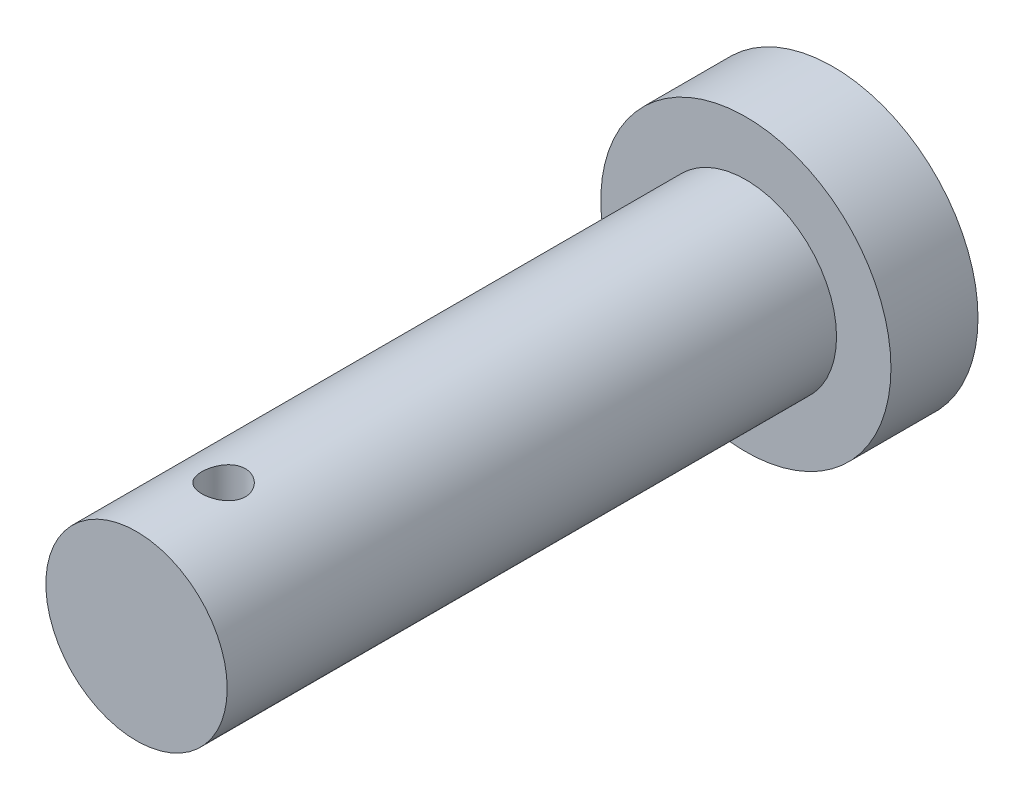
ISO-10303-21;
HEADER;
FILE_DESCRIPTION(('STEP AP214'),'2;1');
FILE_NAME('part.step','',(''),(''),'','','');
FILE_SCHEMA(('AUTOMOTIVE_DESIGN { 1 0 10303 214 1 1 1 1 }'));
ENDSEC;
DATA;
#1=APPLICATION_CONTEXT('core data for automotive mechanical design processes');
#2=APPLICATION_PROTOCOL_DEFINITION('international standard','automotive_design',2000,#1);
#3=PRODUCT_CONTEXT('',#1,'mechanical');
#4=PRODUCT('Part','Part','',(#3));
#5=PRODUCT_RELATED_PRODUCT_CATEGORY('part','',(#4));
#6=PRODUCT_DEFINITION_FORMATION('','',#4);
#7=PRODUCT_DEFINITION_CONTEXT('part definition',#1,'design');
#8=PRODUCT_DEFINITION('design','',#6,#7);
#9=PRODUCT_DEFINITION_SHAPE('','',#8);
#10=(LENGTH_UNIT() NAMED_UNIT(*) SI_UNIT(.MILLI.,.METRE.));
#11=(NAMED_UNIT(*) PLANE_ANGLE_UNIT() SI_UNIT($,.RADIAN.));
#12=(NAMED_UNIT(*) SI_UNIT($,.STERADIAN.) SOLID_ANGLE_UNIT());
#13=UNCERTAINTY_MEASURE_WITH_UNIT(LENGTH_MEASURE(1.E-05),#10,'distance_accuracy_value','');
#14=(GEOMETRIC_REPRESENTATION_CONTEXT(3) GLOBAL_UNCERTAINTY_ASSIGNED_CONTEXT((#13)) GLOBAL_UNIT_ASSIGNED_CONTEXT((#10,
#11,#12)) REPRESENTATION_CONTEXT('',''));
#15=CARTESIAN_POINT('',(0.,0.,0.));
#16=DIRECTION('',(0.,0.,1.));
#17=DIRECTION('',(1.,0.,0.));
#18=AXIS2_PLACEMENT_3D('',#15,#16,#17);
#19=CARTESIAN_POINT('',(0.,0.,12.));
#20=DIRECTION('',(0.,0.,-1.));
#21=DIRECTION('',(-1.,0.,0.));
#22=AXIS2_PLACEMENT_3D('',#19,#20,#21);
#23=CYLINDRICAL_SURFACE('',#22,20.);
#24=CARTESIAN_POINT('',(0.,0.,12.));
#25=DIRECTION('',(0.,0.,1.));
#26=DIRECTION('',(1.,0.,0.));
#27=AXIS2_PLACEMENT_3D('',#24,#25,#26);
#28=CIRCLE('',#27,20.);
#29=CARTESIAN_POINT('',(20.,0.,12.));
#30=VERTEX_POINT('',#29);
#31=EDGE_CURVE('E43',#30,#30,#28,.T.);
#32=ORIENTED_EDGE('',*,*,#31,.F.);
#33=EDGE_LOOP('',(#32));
#34=FACE_BOUND('',#33,.T.);
#35=CARTESIAN_POINT('',(0.,0.,0.));
#36=DIRECTION('',(0.,0.,1.));
#37=DIRECTION('',(1.,0.,0.));
#38=AXIS2_PLACEMENT_3D('',#35,#36,#37);
#39=CIRCLE('',#38,20.);
#40=CARTESIAN_POINT('',(20.,0.,0.));
#41=VERTEX_POINT('',#40);
#42=EDGE_CURVE('E48',#41,#41,#39,.T.);
#43=ORIENTED_EDGE('',*,*,#42,.T.);
#44=EDGE_LOOP('',(#43));
#45=FACE_BOUND('',#44,.T.);
#46=ADVANCED_FACE('F31',(#34,#45),#23,.T.);
#47=CARTESIAN_POINT('',(0.,0.,12.));
#48=DIRECTION('',(0.,0.,1.));
#49=DIRECTION('',(1.,0.,0.));
#50=AXIS2_PLACEMENT_3D('',#47,#48,#49);
#51=PLANE('',#50);
#52=CARTESIAN_POINT('',(0.,0.,12.));
#53=DIRECTION('',(0.,0.,1.));
#54=DIRECTION('',(1.,0.,0.));
#55=AXIS2_PLACEMENT_3D('',#52,#53,#54);
#56=CIRCLE('',#55,12.5);
#57=CARTESIAN_POINT('',(12.5,0.,12.));
#58=VERTEX_POINT('',#57);
#59=EDGE_CURVE('E10',#58,#58,#56,.T.);
#60=ORIENTED_EDGE('',*,*,#59,.F.);
#61=EDGE_LOOP('',(#60));
#62=FACE_BOUND('',#61,.T.);
#63=ORIENTED_EDGE('',*,*,#31,.T.);
#64=EDGE_LOOP('',(#63));
#65=FACE_BOUND('',#64,.T.);
#66=ADVANCED_FACE('F79',(#62,#65),#51,.T.);
#67=CARTESIAN_POINT('',(0.,0.,0.));
#68=DIRECTION('',(0.,0.,1.));
#69=DIRECTION('',(1.,0.,0.));
#70=AXIS2_PLACEMENT_3D('',#67,#68,#69);
#71=PLANE('',#70);
#72=ORIENTED_EDGE('',*,*,#42,.F.);
#73=EDGE_LOOP('',(#72));
#74=FACE_BOUND('',#73,.T.);
#75=ADVANCED_FACE('F75',(#74),#71,.F.);
#76=CARTESIAN_POINT('',(0.,0.,96.));
#77=DIRECTION('',(0.,0.,-1.));
#78=DIRECTION('',(-1.,0.,0.));
#79=AXIS2_PLACEMENT_3D('',#76,#77,#78);
#80=CYLINDRICAL_SURFACE('',#79,12.5);
#81=CARTESIAN_POINT('',(0.,-12.5,87.));
#82=CARTESIAN_POINT('',(0.165963929028717,-12.4999970714968,86.9999949759227));
#83=CARTESIAN_POINT('',(0.33198542092807,-12.4966615634859,86.9861815897639));
#84=CARTESIAN_POINT('',(0.659284290971383,-12.4836783946933,86.9313672604046));
#85=CARTESIAN_POINT('',(0.820558683214276,-12.4740268462166,86.8903495720053));
#86=CARTESIAN_POINT('',(1.13358839471402,-12.4494823208195,86.7825076654957));
#87=CARTESIAN_POINT('',(1.28535442324823,-12.4345953702841,86.7157131101424));
#88=CARTESIAN_POINT('',(1.57552517879764,-12.4011725442513,86.5583145635541));
#89=CARTESIAN_POINT('',(1.71392971475167,-12.3826366165873,86.4677102319227));
#90=CARTESIAN_POINT('',(1.97609263393972,-12.3435386014785,86.2634358216245));
#91=CARTESIAN_POINT('',(2.0995595210048,-12.3229472454311,86.1493972189507));
#92=CARTESIAN_POINT('',(2.32581080811943,-12.2822574370147,85.9022811309354));
#93=CARTESIAN_POINT('',(2.42859304624489,-12.2621590363612,85.7692016579591));
#94=CARTESIAN_POINT('',(2.61189993555015,-12.224437969062,85.4855541669825));
#95=CARTESIAN_POINT('',(2.69210377047565,-12.2068525815312,85.3347734162411));
#96=CARTESIAN_POINT('',(2.82591582947333,-12.1765733412448,85.0213801648715));
#97=CARTESIAN_POINT('',(2.87952794169564,-12.1638787734309,84.8587693979768));
#98=CARTESIAN_POINT('',(2.95765058108663,-12.1451184675007,84.5295234267311));
#99=CARTESIAN_POINT('',(2.98268262400617,-12.1389341034343,84.3630188784745));
#100=CARTESIAN_POINT('',(3.00455808879087,-12.1335389605945,84.0280676203572));
#101=CARTESIAN_POINT('',(3.00140571682399,-12.1343271412568,83.8596212040431));
#102=CARTESIAN_POINT('',(2.96741912081942,-12.1426811387008,83.5295240339871));
#103=CARTESIAN_POINT('',(2.93720103400494,-12.1500960921292,83.3678054348104));
#104=CARTESIAN_POINT('',(2.85092141637189,-12.1706283738785,83.0518026833522));
#105=CARTESIAN_POINT('',(2.79485817372027,-12.1837460799133,82.8975190242656));
#106=CARTESIAN_POINT('',(2.65794121231782,-12.2143476734445,82.5990870219156));
#107=CARTESIAN_POINT('',(2.5768594824696,-12.2318714325758,82.4550475470833));
#108=CARTESIAN_POINT('',(2.39236688956383,-12.2692875046197,82.1823954992774));
#109=CARTESIAN_POINT('',(2.28895240342647,-12.2891802016137,82.0537854347149));
#110=CARTESIAN_POINT('',(2.05951493908846,-12.329732025739,81.8121064296813));
#111=CARTESIAN_POINT('',(1.93297064389908,-12.3503975788014,81.6995329009378));
#112=CARTESIAN_POINT('',(1.66255592459691,-12.3896951594929,81.4971152802536));
#113=CARTESIAN_POINT('',(1.51868504982141,-12.4083271342049,81.4072717797074));
#114=CARTESIAN_POINT('',(1.21702847718581,-12.4415394956922,81.2527027793872));
#115=CARTESIAN_POINT('',(1.05920278696054,-12.4561077058019,81.1880525437622));
#116=CARTESIAN_POINT('',(0.734497606078671,-12.4794620474154,81.0863349209514));
#117=CARTESIAN_POINT('',(0.567619713387657,-12.4882491958651,81.0492626823732));
#118=CARTESIAN_POINT('',(0.233787399651659,-12.4989027542709,81.004497935348));
#119=CARTESIAN_POINT('',(0.0669284805450024,-12.5009282130753,80.9961301075384));
#120=CARTESIAN_POINT('',(-0.265804381586633,-12.4982807419474,81.0071667668509));
#121=CARTESIAN_POINT('',(-0.431678404764955,-12.4936083648176,81.0265689619872));
#122=CARTESIAN_POINT('',(-0.755422580108848,-12.4781916395217,81.0920369785164));
#123=CARTESIAN_POINT('',(-0.913370579311303,-12.4675301590363,81.1377391095738));
#124=CARTESIAN_POINT('',(-1.21935330013476,-12.4413335015664,81.2540981916953));
#125=CARTESIAN_POINT('',(-1.3673870666415,-12.4257978558334,81.3247575429781));
#126=CARTESIAN_POINT('',(-1.6520615099557,-12.3911910149582,81.4903665935979));
#127=CARTESIAN_POINT('',(-1.78847176740356,-12.3720653178033,81.5857007169244));
#128=CARTESIAN_POINT('',(-2.04359904096633,-12.3324936406987,81.7974569290134));
#129=CARTESIAN_POINT('',(-2.16231325074337,-12.3120474520734,81.9138823560808));
#130=CARTESIAN_POINT('',(-2.38142453789942,-12.2715742142771,82.1676408312086));
#131=CARTESIAN_POINT('',(-2.4813497404737,-12.2515669262668,82.3053851220821));
#132=CARTESIAN_POINT('',(-2.65666020824082,-12.2147538797452,82.5960904278967));
#133=CARTESIAN_POINT('',(-2.7320465722335,-12.1979479778962,82.7490507610935));
#134=CARTESIAN_POINT('',(-2.85558993518172,-12.1696189519335,83.065012513544));
#135=CARTESIAN_POINT('',(-2.90390754385905,-12.1580647463107,83.2279482034212));
#136=CARTESIAN_POINT('',(-2.97238380283979,-12.1415072663683,83.5599461850207));
#137=CARTESIAN_POINT('',(-2.99254804274991,-12.1365026916888,83.7290072537618));
#138=CARTESIAN_POINT('',(-3.00387066449354,-12.1337046220624,84.0636707002806));
#139=CARTESIAN_POINT('',(-2.99578106592266,-12.1357241633848,84.2292464963267));
#140=CARTESIAN_POINT('',(-2.95253345626268,-12.1463176460425,84.5565997642237));
#141=CARTESIAN_POINT('',(-2.91737590900096,-12.1548914750658,84.7183773011114));
#142=CARTESIAN_POINT('',(-2.82138591303537,-12.1775274976748,85.0327975525482));
#143=CARTESIAN_POINT('',(-2.76068402045612,-12.191561756094,85.1854822725838));
#144=CARTESIAN_POINT('',(-2.61543373580583,-12.2235433612686,85.4786044138837));
#145=CARTESIAN_POINT('',(-2.53088229934855,-12.2414912075257,85.6190402685864));
#146=CARTESIAN_POINT('',(-2.33793007708464,-12.279819325529,85.8873370001195));
#147=CARTESIAN_POINT('',(-2.22900267979018,-12.3002478697533,86.0148123230987));
#148=CARTESIAN_POINT('',(-1.99143074773236,-12.3409359831145,86.2499199880519));
#149=CARTESIAN_POINT('',(-1.86278158874234,-12.361195511444,86.3575476632103));
#150=CARTESIAN_POINT('',(-1.5868829988014,-12.3996570299581,86.5516092595548));
#151=CARTESIAN_POINT('',(-1.43936414359401,-12.4178200201219,86.637668405442));
#152=CARTESIAN_POINT('',(-1.13153622828567,-12.4496380610582,86.7836295327479));
#153=CARTESIAN_POINT('',(-0.97123697369122,-12.4632965272855,86.8435513433916));
#154=CARTESIAN_POINT('',(-0.675887025694769,-12.4824059901497,86.9260386251378));
#155=CARTESIAN_POINT('',(-0.542312066268424,-12.4889599449579,86.9537166157857));
#156=CARTESIAN_POINT('',(-0.27250422747825,-12.4977580149525,86.9906987808519));
#157=CARTESIAN_POINT('',(-0.136271517915778,-12.5000024045682,87.0000041252255));
#158=CARTESIAN_POINT('',(0.,-12.5,87.));
#159=B_SPLINE_CURVE_WITH_KNOTS('',3,(#81,#82,#83,#84,#85,#86,#87,#88,#89,#90,#91,#92,#93,#94,
#95,#96,#97,#98,#99,#100,#101,#102,#103,#104,#105,#106,#107,#108,#109,#110,#111,#112,#113,#114,
#115,#116,#117,#118,#119,#120,#121,#122,#123,#124,#125,#126,#127,#128,#129,#130,#131,#132,#133,
#134,#135,#136,#137,#138,#139,#140,#141,#142,#143,#144,#145,#146,#147,#148,#149,#150,#151,#152,
#153,#154,#155,#156,#157,#158),.UNSPECIFIED.,.T.,.F.,(4,2,2,2,2,2,2,2,2,2,2,2,2,2,2,2,2,2,2,2,2,
2,2,2,2,2,2,2,2,2,2,2,2,2,2,2,2,2,4),(0.,0.497392599366682,0.995091645758826,1.49221966408502,
1.9893547899852,2.49500570148358,3.00070943533306,3.5132726205085,4.02576083835038,
4.52873995359111,5.03164400680464,5.52338274964839,6.01515406709139,6.51154667521173,
7.00801987450004,7.51749958381935,8.02699254752171,8.53799614678204,9.04890983140416,
9.54771776810827,10.0464845383097,10.5385143736981,11.0305915421211,11.5308523313794,
12.0311923705731,12.5427824523192,13.0543496229378,13.5628484119093,14.0712462285019,
14.5662165454702,15.0611783809799,15.5536406351284,16.0461657803879,16.5505844610431,
17.055121595827,17.5678974206352,18.0802835459069,18.4887142303991,18.897118905514),.UNSPECIFIED.);
#160=CARTESIAN_POINT('',(0.,-12.5,87.));
#161=VERTEX_POINT('',#160);
#162=EDGE_CURVE('E34',#161,#161,#159,.T.);
#163=ORIENTED_EDGE('',*,*,#162,.T.);
#164=EDGE_LOOP('',(#163));
#165=FACE_BOUND('',#164,.T.);
#166=CARTESIAN_POINT('',(0.,12.5,87.));
#167=CARTESIAN_POINT('',(-0.165963929028717,12.4999970714968,86.9999949759227));
#168=CARTESIAN_POINT('',(-0.331985420928069,12.4966615634859,86.9861815897639));
#169=CARTESIAN_POINT('',(-0.659284290971382,12.4836783946932,86.9313672604046));
#170=CARTESIAN_POINT('',(-0.820558683214275,12.4740268462166,86.8903495720053));
#171=CARTESIAN_POINT('',(-1.13358839471402,12.4494823208195,86.7825076654957));
#172=CARTESIAN_POINT('',(-1.28535442324823,12.4345953702841,86.7157131101424));
#173=CARTESIAN_POINT('',(-1.57552517879764,12.4011725442513,86.5583145635541));
#174=CARTESIAN_POINT('',(-1.71392971475166,12.3826366165873,86.4677102319227));
#175=CARTESIAN_POINT('',(-1.97609263393972,12.3435386014785,86.2634358216245));
#176=CARTESIAN_POINT('',(-2.0995595210048,12.3229472454311,86.1493972189508));
#177=CARTESIAN_POINT('',(-2.32581080811943,12.2822574370147,85.9022811309354));
#178=CARTESIAN_POINT('',(-2.42859304624489,12.2621590363612,85.7692016579591));
#179=CARTESIAN_POINT('',(-2.61189993555015,12.224437969062,85.4855541669826));
#180=CARTESIAN_POINT('',(-2.69210377047565,12.2068525815312,85.3347734162412));
#181=CARTESIAN_POINT('',(-2.82591582947333,12.1765733412448,85.0213801648715));
#182=CARTESIAN_POINT('',(-2.87952794169564,12.1638787734309,84.8587693979768));
#183=CARTESIAN_POINT('',(-2.95765058108663,12.1451184675007,84.5295234267311));
#184=CARTESIAN_POINT('',(-2.98268262400617,12.1389341034343,84.3630188784745));
#185=CARTESIAN_POINT('',(-3.00455808879087,12.1335389605945,84.0280676203572));
#186=CARTESIAN_POINT('',(-3.00140571682399,12.1343271412568,83.8596212040431));
#187=CARTESIAN_POINT('',(-2.96741912081942,12.1426811387008,83.5295240339871));
#188=CARTESIAN_POINT('',(-2.93720103400494,12.1500960921292,83.3678054348104));
#189=CARTESIAN_POINT('',(-2.85092141637189,12.1706283738785,83.0518026833522));
#190=CARTESIAN_POINT('',(-2.79485817372027,12.1837460799133,82.8975190242656));
#191=CARTESIAN_POINT('',(-2.65794121231782,12.2143476734445,82.5990870219156));
#192=CARTESIAN_POINT('',(-2.5768594824696,12.2318714325758,82.4550475470833));
#193=CARTESIAN_POINT('',(-2.39236688956383,12.2692875046197,82.1823954992774));
#194=CARTESIAN_POINT('',(-2.28895240342647,12.2891802016137,82.0537854347149));
#195=CARTESIAN_POINT('',(-2.05951493908846,12.329732025739,81.8121064296813));
#196=CARTESIAN_POINT('',(-1.93297064389908,12.3503975788014,81.6995329009378));
#197=CARTESIAN_POINT('',(-1.66255592459691,12.3896951594929,81.4971152802536));
#198=CARTESIAN_POINT('',(-1.51868504982141,12.4083271342049,81.4072717797074));
#199=CARTESIAN_POINT('',(-1.21702847718581,12.4415394956922,81.2527027793872));
#200=CARTESIAN_POINT('',(-1.05920278696054,12.4561077058019,81.1880525437622));
#201=CARTESIAN_POINT('',(-0.734497606078671,12.4794620474154,81.0863349209514));
#202=CARTESIAN_POINT('',(-0.567619713387657,12.4882491958651,81.0492626823732));
#203=CARTESIAN_POINT('',(-0.23378739965166,12.4989027542709,81.004497935348));
#204=CARTESIAN_POINT('',(-0.0669284805450043,12.5009282130753,80.9961301075384));
#205=CARTESIAN_POINT('',(0.265804381586631,12.4982807419474,81.0071667668509));
#206=CARTESIAN_POINT('',(0.431678404764954,12.4936083648176,81.0265689619872));
#207=CARTESIAN_POINT('',(0.755422580108846,12.4781916395217,81.0920369785164));
#208=CARTESIAN_POINT('',(0.913370579311301,12.4675301590363,81.1377391095738));
#209=CARTESIAN_POINT('',(1.21935330013476,12.4413335015664,81.2540981916953));
#210=CARTESIAN_POINT('',(1.3673870666415,12.4257978558334,81.3247575429781));
#211=CARTESIAN_POINT('',(1.6520615099557,12.3911910149582,81.4903665935978));
#212=CARTESIAN_POINT('',(1.78847176740356,12.3720653178033,81.5857007169244));
#213=CARTESIAN_POINT('',(2.04359904096633,12.3324936406987,81.7974569290134));
#214=CARTESIAN_POINT('',(2.16231325074337,12.3120474520734,81.9138823560808));
#215=CARTESIAN_POINT('',(2.38142453789942,12.2715742142771,82.1676408312086));
#216=CARTESIAN_POINT('',(2.4813497404737,12.2515669262668,82.3053851220821));
#217=CARTESIAN_POINT('',(2.65666020824082,12.2147538797452,82.5960904278967));
#218=CARTESIAN_POINT('',(2.7320465722335,12.1979479778962,82.7490507610935));
#219=CARTESIAN_POINT('',(2.85558993518172,12.1696189519335,83.065012513544));
#220=CARTESIAN_POINT('',(2.90390754385905,12.1580647463107,83.2279482034212));
#221=CARTESIAN_POINT('',(2.97238380283979,12.1415072663683,83.5599461850207));
#222=CARTESIAN_POINT('',(2.99254804274991,12.1365026916888,83.7290072537618));
#223=CARTESIAN_POINT('',(3.00387066449354,12.1337046220624,84.0636707002806));
#224=CARTESIAN_POINT('',(2.99578106592266,12.1357241633848,84.2292464963267));
#225=CARTESIAN_POINT('',(2.95253345626268,12.1463176460425,84.5565997642237));
#226=CARTESIAN_POINT('',(2.91737590900096,12.1548914750658,84.7183773011114));
#227=CARTESIAN_POINT('',(2.82138591303537,12.1775274976748,85.0327975525482));
#228=CARTESIAN_POINT('',(2.76068402045612,12.191561756094,85.1854822725838));
#229=CARTESIAN_POINT('',(2.61543373580583,12.2235433612686,85.4786044138837));
#230=CARTESIAN_POINT('',(2.53088229934856,12.2414912075257,85.6190402685864));
#231=CARTESIAN_POINT('',(2.33793007708465,12.279819325529,85.8873370001195));
#232=CARTESIAN_POINT('',(2.22900267979019,12.3002478697533,86.0148123230987));
#233=CARTESIAN_POINT('',(1.99143074773238,12.3409359831145,86.2499199880519));
#234=CARTESIAN_POINT('',(1.86278158874235,12.361195511444,86.3575476632102));
#235=CARTESIAN_POINT('',(1.58688299880141,12.3996570299581,86.5516092595548));
#236=CARTESIAN_POINT('',(1.43936414359403,12.4178200201219,86.637668405442));
#237=CARTESIAN_POINT('',(1.13153622828568,12.4496380610582,86.7836295327479));
#238=CARTESIAN_POINT('',(0.971236973691227,12.4632965272855,86.8435513433916));
#239=CARTESIAN_POINT('',(0.675887025694769,12.4824059901497,86.9260386251378));
#240=CARTESIAN_POINT('',(0.542312066268424,12.4889599449579,86.9537166157857));
#241=CARTESIAN_POINT('',(0.27250422747825,12.4977580149525,86.9906987808519));
#242=CARTESIAN_POINT('',(0.136271517915777,12.5000024045682,87.0000041252255));
#243=CARTESIAN_POINT('',(0.,12.5,87.));
#244=B_SPLINE_CURVE_WITH_KNOTS('',3,(#166,#167,#168,#169,#170,#171,#172,#173,#174,#175,#176,
#177,#178,#179,#180,#181,#182,#183,#184,#185,#186,#187,#188,#189,#190,#191,#192,#193,#194,#195,
#196,#197,#198,#199,#200,#201,#202,#203,#204,#205,#206,#207,#208,#209,#210,#211,#212,#213,#214,
#215,#216,#217,#218,#219,#220,#221,#222,#223,#224,#225,#226,#227,#228,#229,#230,#231,#232,#233,
#234,#235,#236,#237,#238,#239,#240,#241,#242,#243),.UNSPECIFIED.,.T.,.F.,(4,2,2,2,2,2,2,2,2,2,2,
2,2,2,2,2,2,2,2,2,2,2,2,2,2,2,2,2,2,2,2,2,2,2,2,2,2,2,4),(0.,0.497392599366681,
0.995091645758826,1.49221966408502,1.9893547899852,2.49500570148356,3.00070943533306,
3.51327262050848,4.02576083835038,4.52873995359111,5.03164400680464,5.52338274964839,
6.01515406709139,6.51154667521173,7.00801987450004,7.51749958381935,8.02699254752171,
8.53799614678204,9.04890983140416,9.54771776810827,10.0464845383097,10.5385143736981,
11.0305915421211,11.5308523313794,12.0311923705731,12.5427824523192,13.0543496229378,
13.5628484119093,14.0712462285019,14.5662165454702,15.0611783809799,15.5536406351284,
16.0461657803879,16.5505844610431,17.0551215958269,17.5678974206352,18.0802835459069,
18.4887142303991,18.897118905514),.UNSPECIFIED.);
#245=CARTESIAN_POINT('',(0.,12.5,87.));
#246=VERTEX_POINT('',#245);
#247=EDGE_CURVE('E54',#246,#246,#244,.T.);
#248=ORIENTED_EDGE('',*,*,#247,.T.);
#249=EDGE_LOOP('',(#248));
#250=FACE_BOUND('',#249,.T.);
#251=CARTESIAN_POINT('',(0.,0.,96.));
#252=DIRECTION('',(0.,0.,1.));
#253=DIRECTION('',(1.,0.,0.));
#254=AXIS2_PLACEMENT_3D('',#251,#252,#253);
#255=CIRCLE('',#254,12.5);
#256=CARTESIAN_POINT('',(12.5,0.,96.));
#257=VERTEX_POINT('',#256);
#258=EDGE_CURVE('E51',#257,#257,#255,.T.);
#259=ORIENTED_EDGE('',*,*,#258,.F.);
#260=EDGE_LOOP('',(#259));
#261=FACE_BOUND('',#260,.T.);
#262=ORIENTED_EDGE('',*,*,#59,.T.);
#263=EDGE_LOOP('',(#262));
#264=FACE_BOUND('',#263,.T.);
#265=ADVANCED_FACE('F59',(#165,#250,#261,#264),#80,.T.);
#266=CARTESIAN_POINT('',(0.,0.,96.));
#267=DIRECTION('',(0.,0.,1.));
#268=DIRECTION('',(1.,0.,0.));
#269=AXIS2_PLACEMENT_3D('',#266,#267,#268);
#270=PLANE('',#269);
#271=ORIENTED_EDGE('',*,*,#258,.T.);
#272=EDGE_LOOP('',(#271));
#273=FACE_BOUND('',#272,.T.);
#274=ADVANCED_FACE('F66',(#273),#270,.T.);
#275=CARTESIAN_POINT('',(0.,-25.,84.));
#276=DIRECTION('',(0.,1.,0.));
#277=DIRECTION('',(0.,0.,1.));
#278=AXIS2_PLACEMENT_3D('',#275,#276,#277);
#279=CYLINDRICAL_SURFACE('',#278,3.);
#280=ORIENTED_EDGE('',*,*,#247,.F.);
#281=EDGE_LOOP('',(#280));
#282=FACE_BOUND('',#281,.T.);
#283=ORIENTED_EDGE('',*,*,#162,.F.);
#284=EDGE_LOOP('',(#283));
#285=FACE_BOUND('',#284,.T.);
#286=ADVANCED_FACE('F63',(#282,#285),#279,.F.);
#287=CLOSED_SHELL('',(#46,#66,#75,#265,#274,#286));
#288=MANIFOLD_SOLID_BREP('B2',#287);
#289=ADVANCED_BREP_SHAPE_REPRESENTATION('',(#18,#288),#14);
#290=SHAPE_DEFINITION_REPRESENTATION(#9,#289);
ENDSEC;
END-ISO-10303-21;
